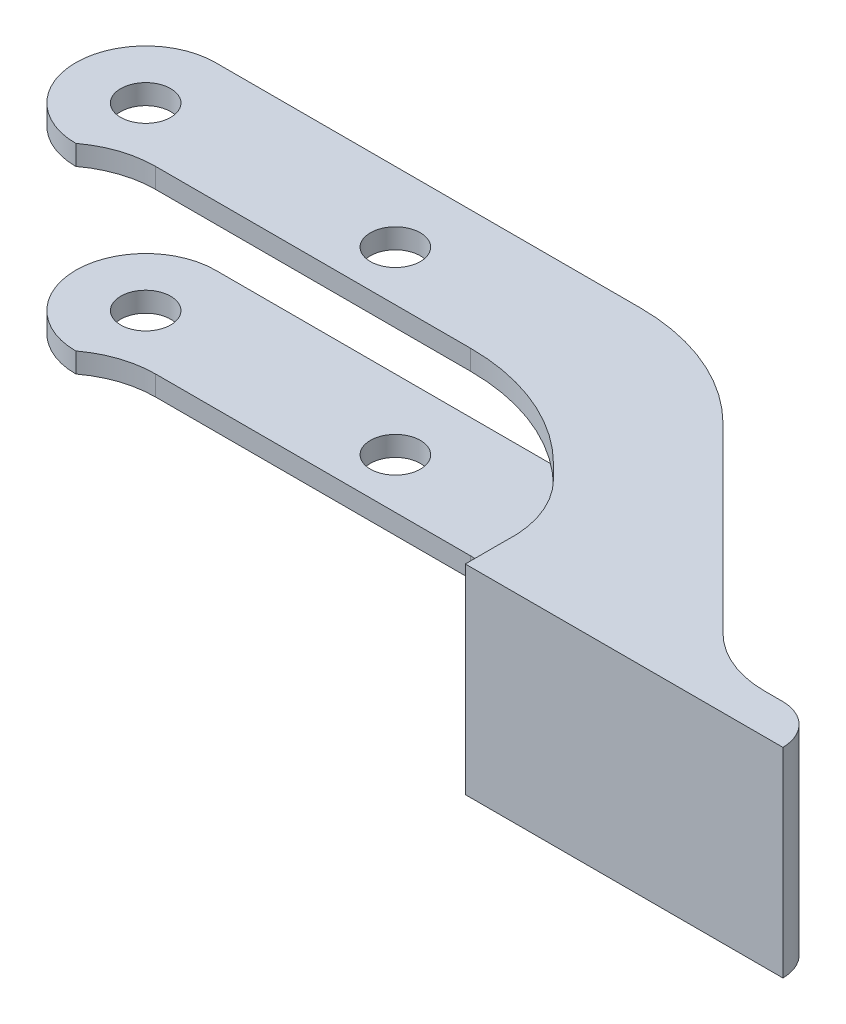
ISO-10303-21;
HEADER;
FILE_DESCRIPTION(('STEP AP214'),'2;1');
FILE_NAME('part.step','',(''),(''),'','','');
FILE_SCHEMA(('AUTOMOTIVE_DESIGN { 1 0 10303 214 1 1 1 1 }'));
ENDSEC;
DATA;
#1=APPLICATION_CONTEXT('core data for automotive mechanical design processes');
#2=APPLICATION_PROTOCOL_DEFINITION('international standard','automotive_design',2000,#1);
#3=PRODUCT_CONTEXT('',#1,'mechanical');
#4=PRODUCT('Part','Part','',(#3));
#5=PRODUCT_RELATED_PRODUCT_CATEGORY('part','',(#4));
#6=PRODUCT_DEFINITION_FORMATION('','',#4);
#7=PRODUCT_DEFINITION_CONTEXT('part definition',#1,'design');
#8=PRODUCT_DEFINITION('design','',#6,#7);
#9=PRODUCT_DEFINITION_SHAPE('','',#8);
#10=(LENGTH_UNIT() NAMED_UNIT(*) SI_UNIT(.MILLI.,.METRE.));
#11=(NAMED_UNIT(*) PLANE_ANGLE_UNIT() SI_UNIT($,.RADIAN.));
#12=(NAMED_UNIT(*) SI_UNIT($,.STERADIAN.) SOLID_ANGLE_UNIT());
#13=UNCERTAINTY_MEASURE_WITH_UNIT(LENGTH_MEASURE(1.E-05),#10,'distance_accuracy_value','');
#14=(GEOMETRIC_REPRESENTATION_CONTEXT(3) GLOBAL_UNCERTAINTY_ASSIGNED_CONTEXT((#13)) GLOBAL_UNIT_ASSIGNED_CONTEXT((#10,
#11,#12)) REPRESENTATION_CONTEXT('',''));
#15=CARTESIAN_POINT('',(0.,0.,0.));
#16=DIRECTION('',(0.,0.,1.));
#17=DIRECTION('',(1.,0.,0.));
#18=AXIS2_PLACEMENT_3D('',#15,#16,#17);
#19=CARTESIAN_POINT('',(55.9705627484771,0.,20.0040024503266));
#20=DIRECTION('',(0.,0.,-1.));
#21=DIRECTION('',(-1.,0.,0.));
#22=AXIS2_PLACEMENT_3D('',#19,#20,#21);
#23=PLANE('',#22);
#24=DIRECTION('',(0.,1.,0.));
#25=VECTOR('',#24,1.);
#26=CARTESIAN_POINT('',(55.9705627484771,0.,20.0040024503266));
#27=LINE('',#26,#25);
#28=CARTESIAN_POINT('',(55.9705627484771,2.,20.0040024503266));
#29=VERTEX_POINT('',#28);
#30=CARTESIAN_POINT('',(55.9705627484771,18.,20.0040024503266));
#31=VERTEX_POINT('',#30);
#32=EDGE_CURVE('E318',#29,#31,#27,.T.);
#33=ORIENTED_EDGE('',*,*,#32,.T.);
#34=DIRECTION('',(1.,0.,0.));
#35=VECTOR('',#34,1.);
#36=CARTESIAN_POINT('',(55.9705627484771,18.,20.0040024503266));
#37=LINE('',#36,#35);
#38=CARTESIAN_POINT('',(81.9451279472808,18.,20.0040024503266));
#39=VERTEX_POINT('',#38);
#40=EDGE_CURVE('E268',#31,#39,#37,.T.);
#41=ORIENTED_EDGE('',*,*,#40,.T.);
#42=DIRECTION('',(0.,1.,0.));
#43=VECTOR('',#42,1.);
#44=CARTESIAN_POINT('',(81.9451279472808,0.,20.0040024503266));
#45=LINE('',#44,#43);
#46=CARTESIAN_POINT('',(81.9451279472808,20.,20.0040024503266));
#47=VERTEX_POINT('',#46);
#48=EDGE_CURVE('E216',#39,#47,#45,.T.);
#49=ORIENTED_EDGE('',*,*,#48,.T.);
#50=DIRECTION('',(-1.,0.,0.));
#51=VECTOR('',#50,1.);
#52=CARTESIAN_POINT('',(55.9705627484771,20.,20.0040024503266));
#53=LINE('',#52,#51);
#54=CARTESIAN_POINT('',(83.76969240085,20.,20.0040024503266));
#55=VERTEX_POINT('',#54);
#56=EDGE_CURVE('E213',#55,#47,#53,.T.);
#57=ORIENTED_EDGE('',*,*,#56,.F.);
#58=DIRECTION('',(0.,1.,0.));
#59=VECTOR('',#58,1.);
#60=CARTESIAN_POINT('',(83.76969240085,0.,20.0040024503266));
#61=LINE('',#60,#59);
#62=CARTESIAN_POINT('',(83.76969240085,0.,20.0040024503266));
#63=VERTEX_POINT('',#62);
#64=EDGE_CURVE('E206',#55,#63,#61,.F.);
#65=ORIENTED_EDGE('',*,*,#64,.T.);
#66=DIRECTION('',(-1.,0.,0.));
#67=VECTOR('',#66,1.);
#68=CARTESIAN_POINT('',(55.9705627484771,0.,20.0040024503266));
#69=LINE('',#68,#67);
#70=CARTESIAN_POINT('',(81.9451279472808,0.,20.0040024503266));
#71=VERTEX_POINT('',#70);
#72=EDGE_CURVE('E210',#63,#71,#69,.T.);
#73=ORIENTED_EDGE('',*,*,#72,.T.);
#74=DIRECTION('',(0.,1.,0.));
#75=VECTOR('',#74,1.);
#76=CARTESIAN_POINT('',(81.9451279472808,2.,20.0040024503266));
#77=LINE('',#76,#75);
#78=CARTESIAN_POINT('',(81.9451279472808,2.,20.0040024503266));
#79=VERTEX_POINT('',#78);
#80=EDGE_CURVE('E228',#71,#79,#77,.T.);
#81=ORIENTED_EDGE('',*,*,#80,.T.);
#82=DIRECTION('',(-1.,0.,0.));
#83=VECTOR('',#82,1.);
#84=CARTESIAN_POINT('',(0.,2.,20.0040024503266));
#85=LINE('',#84,#83);
#86=EDGE_CURVE('E250',#79,#29,#85,.T.);
#87=ORIENTED_EDGE('',*,*,#86,.T.);
#88=EDGE_LOOP('',(#33,#41,#49,#57,#65,#73,#81,#87));
#89=FACE_BOUND('',#88,.T.);
#90=ADVANCED_FACE('F38',(#89),#23,.T.);
#91=CARTESIAN_POINT('',(0.,2.,0.));
#92=DIRECTION('',(0.,1.,0.));
#93=DIRECTION('',(0.,0.,1.));
#94=AXIS2_PLACEMENT_3D('',#91,#92,#93);
#95=PLANE('',#94);
#96=CARTESIAN_POINT('',(46.1591362625864,2.,0.));
#97=DIRECTION('',(0.,1.,0.));
#98=DIRECTION('',(0.,0.,1.));
#99=AXIS2_PLACEMENT_3D('',#96,#97,#98);
#100=CIRCLE('',#99,3.);
#101=CARTESIAN_POINT('',(46.1591362625864,2.,3.));
#102=VERTEX_POINT('',#101);
#103=EDGE_CURVE('E454',#102,#102,#100,.T.);
#104=ORIENTED_EDGE('',*,*,#103,.F.);
#105=EDGE_LOOP('',(#104));
#106=FACE_BOUND('',#105,.T.);
#107=CARTESIAN_POINT('',(0.,2.,0.));
#108=DIRECTION('',(0.,1.,0.));
#109=DIRECTION('',(0.,0.,1.));
#110=AXIS2_PLACEMENT_3D('',#107,#108,#109);
#111=CIRCLE('',#110,7.);
#112=CARTESIAN_POINT('',(0.,2.,-7.));
#113=VERTEX_POINT('',#112);
#114=CARTESIAN_POINT('',(0.,2.,7.));
#115=VERTEX_POINT('',#114);
#116=EDGE_CURVE('E287',#113,#115,#111,.T.);
#117=ORIENTED_EDGE('',*,*,#116,.T.);
#118=CARTESIAN_POINT('',(5.99999999999999,2.,15.));
#119=DIRECTION('',(0.,1.,0.));
#120=DIRECTION('',(0.,0.,1.));
#121=AXIS2_PLACEMENT_3D('',#118,#119,#120);
#122=CIRCLE('',#121,10.);
#123=CARTESIAN_POINT('',(5.99999999999999,2.,4.99999999999999));
#124=VERTEX_POINT('',#123);
#125=EDGE_CURVE('E46',#115,#124,#122,.F.);
#126=ORIENTED_EDGE('',*,*,#125,.T.);
#127=DIRECTION('',(-1.,0.,0.));
#128=VECTOR('',#127,1.);
#129=CARTESIAN_POINT('',(0.,2.,4.99999999999999));
#130=LINE('',#129,#128);
#131=CARTESIAN_POINT('',(37.5441558772842,2.,4.99999999999999));
#132=VERTEX_POINT('',#131);
#133=EDGE_CURVE('E379',#132,#124,#130,.T.);
#134=ORIENTED_EDGE('',*,*,#133,.F.);
#135=CARTESIAN_POINT('',(37.5441558772843,2.,25.));
#136=DIRECTION('',(0.,1.,0.));
#137=DIRECTION('',(0.,0.,1.));
#138=AXIS2_PLACEMENT_3D('',#135,#136,#137);
#139=CIRCLE('',#138,20.);
#140=CARTESIAN_POINT('',(51.6862915010153,2.,10.8578643762691));
#141=VERTEX_POINT('',#140);
#142=EDGE_CURVE('E375',#141,#132,#139,.T.);
#143=ORIENTED_EDGE('',*,*,#142,.F.);
#144=DIRECTION('',(-0.707106781186547,0.,-0.707106781186548));
#145=VECTOR('',#144,1.);
#146=CARTESIAN_POINT('',(20.4142135623731,2.,-20.4142135623731));
#147=LINE('',#146,#145);
#148=CARTESIAN_POINT('',(53.0658469263745,2.,12.2374198016283));
#149=VERTEX_POINT('',#148);
#150=EDGE_CURVE('E274',#149,#141,#147,.T.);
#151=ORIENTED_EDGE('',*,*,#150,.F.);
#152=CARTESIAN_POINT('',(45.994779114509,2.,19.3084876134938));
#153=DIRECTION('',(0.,1.,0.));
#154=DIRECTION('',(0.,0.,1.));
#155=AXIS2_PLACEMENT_3D('',#152,#153,#154);
#156=CIRCLE('',#155,10.);
#157=EDGE_CURVE('E408',#149,#29,#156,.F.);
#158=ORIENTED_EDGE('',*,*,#157,.T.);
#159=ORIENTED_EDGE('',*,*,#86,.F.);
#160=CARTESIAN_POINT('',(81.9451279472808,2.,10.0040024503266));
#161=DIRECTION('',(0.,1.,0.));
#162=DIRECTION('',(0.,0.,1.));
#163=AXIS2_PLACEMENT_3D('',#160,#161,#162);
#164=CIRCLE('',#163,10.);
#165=CARTESIAN_POINT('',(74.8740601354152,2.,17.075070262192));
#166=VERTEX_POINT('',#165);
#167=EDGE_CURVE('E247',#79,#166,#164,.F.);
#168=ORIENTED_EDGE('',*,*,#167,.T.);
#169=DIRECTION('',(0.707106781186545,0.,0.70710678118655));
#170=VECTOR('',#169,1.);
#171=CARTESIAN_POINT('',(71.8700576850888,2.,14.0710678118655));
#172=LINE('',#171,#170);
#173=CARTESIAN_POINT('',(56.6568542494924,2.,-1.14213562373091));
#174=VERTEX_POINT('',#173);
#175=EDGE_CURVE('E262',#174,#166,#172,.T.);
#176=ORIENTED_EDGE('',*,*,#175,.F.);
#177=CARTESIAN_POINT('',(42.5147186257615,2.,13.));
#178=DIRECTION('',(0.,-1.,0.));
#179=DIRECTION('',(0.,0.,-1.));
#180=AXIS2_PLACEMENT_3D('',#177,#178,#179);
#181=CIRCLE('',#180,20.);
#182=CARTESIAN_POINT('',(42.5147186257614,2.,-7.));
#183=VERTEX_POINT('',#182);
#184=EDGE_CURVE('E261',#183,#174,#181,.T.);
#185=ORIENTED_EDGE('',*,*,#184,.F.);
#186=DIRECTION('',(-1.,0.,0.));
#187=VECTOR('',#186,1.);
#188=CARTESIAN_POINT('',(0.,2.,-7.));
#189=LINE('',#188,#187);
#190=EDGE_CURVE('E249',#183,#113,#189,.T.);
#191=ORIENTED_EDGE('',*,*,#190,.T.);
#192=EDGE_LOOP('',(#117,#126,#134,#143,#151,#158,#159,#168,#176,#185,#191));
#193=FACE_BOUND('',#192,.T.);
#194=CARTESIAN_POINT('',(0.,2.,0.));
#195=DIRECTION('',(0.,1.,0.));
#196=DIRECTION('',(0.,0.,1.));
#197=AXIS2_PLACEMENT_3D('',#194,#195,#196);
#198=CIRCLE('',#197,2.5);
#199=CARTESIAN_POINT('',(0.,2.,2.5));
#200=VERTEX_POINT('',#199);
#201=EDGE_CURVE('E292',#200,#200,#198,.T.);
#202=ORIENTED_EDGE('',*,*,#201,.F.);
#203=EDGE_LOOP('',(#202));
#204=FACE_BOUND('',#203,.T.);
#205=CARTESIAN_POINT('',(25.,2.,0.));
#206=DIRECTION('',(0.,1.,0.));
#207=DIRECTION('',(0.,0.,1.));
#208=AXIS2_PLACEMENT_3D('',#205,#206,#207);
#209=CIRCLE('',#208,2.5);
#210=CARTESIAN_POINT('',(25.,2.,2.5));
#211=VERTEX_POINT('',#210);
#212=EDGE_CURVE('E295',#211,#211,#209,.T.);
#213=ORIENTED_EDGE('',*,*,#212,.F.);
#214=EDGE_LOOP('',(#213));
#215=FACE_BOUND('',#214,.T.);
#216=ADVANCED_FACE('F433',(#106,#193,#204,#215),#95,.T.);
#217=CARTESIAN_POINT('',(0.,0.,0.));
#218=DIRECTION('',(0.,1.,0.));
#219=DIRECTION('',(0.,0.,1.));
#220=AXIS2_PLACEMENT_3D('',#217,#218,#219);
#221=PLANE('',#220);
#222=DIRECTION('',(0.,0.,1.));
#223=VECTOR('',#222,1.);
#224=CARTESIAN_POINT('',(55.9705627484771,0.,20.0040024503266));
#225=LINE('',#224,#223);
#226=CARTESIAN_POINT('',(55.9705627484771,0.,20.0040024503266));
#227=VERTEX_POINT('',#226);
#228=CARTESIAN_POINT('',(55.9705627484771,0.,23.9705627484772));
#229=VERTEX_POINT('',#228);
#230=EDGE_CURVE('E315',#227,#229,#225,.T.);
#231=ORIENTED_EDGE('',*,*,#230,.F.);
#232=CARTESIAN_POINT('',(45.994779114509,0.,19.3084876134938));
#233=DIRECTION('',(0.,1.,0.));
#234=DIRECTION('',(0.,0.,1.));
#235=AXIS2_PLACEMENT_3D('',#232,#233,#234);
#236=CIRCLE('',#235,10.);
#237=CARTESIAN_POINT('',(53.0658469263745,0.,12.2374198016283));
#238=VERTEX_POINT('',#237);
#239=EDGE_CURVE('E406',#227,#238,#236,.T.);
#240=ORIENTED_EDGE('',*,*,#239,.T.);
#241=DIRECTION('',(0.707106781186547,0.,0.707106781186548));
#242=VECTOR('',#241,1.);
#243=CARTESIAN_POINT('',(60.8324295750727,0.,20.0040024503266));
#244=LINE('',#243,#242);
#245=CARTESIAN_POINT('',(51.6862915010153,0.,10.8578643762691));
#246=VERTEX_POINT('',#245);
#247=EDGE_CURVE('E378',#246,#238,#244,.T.);
#248=ORIENTED_EDGE('',*,*,#247,.F.);
#249=CARTESIAN_POINT('',(37.5441558772843,0.,25.));
#250=DIRECTION('',(0.,-1.,0.));
#251=DIRECTION('',(0.,0.,1.));
#252=AXIS2_PLACEMENT_3D('',#249,#250,#251);
#253=CIRCLE('',#252,20.);
#254=CARTESIAN_POINT('',(37.5441558772842,0.,4.99999999999999));
#255=VERTEX_POINT('',#254);
#256=EDGE_CURVE('E382',#255,#246,#253,.T.);
#257=ORIENTED_EDGE('',*,*,#256,.F.);
#258=DIRECTION('',(1.,0.,0.));
#259=VECTOR('',#258,1.);
#260=CARTESIAN_POINT('',(25.,0.,4.99999999999999));
#261=LINE('',#260,#259);
#262=CARTESIAN_POINT('',(5.99999999999999,0.,4.99999999999999));
#263=VERTEX_POINT('',#262);
#264=EDGE_CURVE('E381',#263,#255,#261,.T.);
#265=ORIENTED_EDGE('',*,*,#264,.F.);
#266=CARTESIAN_POINT('',(5.99999999999999,0.,15.));
#267=DIRECTION('',(0.,1.,0.));
#268=DIRECTION('',(0.,0.,1.));
#269=AXIS2_PLACEMENT_3D('',#266,#267,#268);
#270=CIRCLE('',#269,10.);
#271=CARTESIAN_POINT('',(0.,0.,7.));
#272=VERTEX_POINT('',#271);
#273=EDGE_CURVE('E53',#263,#272,#270,.T.);
#274=ORIENTED_EDGE('',*,*,#273,.T.);
#275=CARTESIAN_POINT('',(0.,0.,0.));
#276=DIRECTION('',(0.,1.,0.));
#277=DIRECTION('',(0.,0.,1.));
#278=AXIS2_PLACEMENT_3D('',#275,#276,#277);
#279=CIRCLE('',#278,7.);
#280=CARTESIAN_POINT('',(0.,0.,-7.));
#281=VERTEX_POINT('',#280);
#282=EDGE_CURVE('E280',#281,#272,#279,.T.);
#283=ORIENTED_EDGE('',*,*,#282,.F.);
#284=DIRECTION('',(-1.,0.,0.));
#285=VECTOR('',#284,1.);
#286=CARTESIAN_POINT('',(0.,0.,-7.));
#287=LINE('',#286,#285);
#288=CARTESIAN_POINT('',(42.5147186257614,0.,-7.));
#289=VERTEX_POINT('',#288);
#290=EDGE_CURVE('E279',#289,#281,#287,.T.);
#291=ORIENTED_EDGE('',*,*,#290,.F.);
#292=CARTESIAN_POINT('',(42.5147186257615,0.,13.));
#293=DIRECTION('',(0.,-1.,0.));
#294=DIRECTION('',(0.,0.,-1.));
#295=AXIS2_PLACEMENT_3D('',#292,#293,#294);
#296=CIRCLE('',#295,20.);
#297=CARTESIAN_POINT('',(56.6568542494924,0.,-1.14213562373091));
#298=VERTEX_POINT('',#297);
#299=EDGE_CURVE('E289',#289,#298,#296,.T.);
#300=ORIENTED_EDGE('',*,*,#299,.T.);
#301=DIRECTION('',(0.707106781186542,0.,0.707106781186553));
#302=VECTOR('',#301,1.);
#303=CARTESIAN_POINT('',(71.8700576850888,0.,14.0710678118655));
#304=LINE('',#303,#302);
#305=CARTESIAN_POINT('',(74.8740601354152,0.,17.075070262192));
#306=VERTEX_POINT('',#305);
#307=EDGE_CURVE('E238',#298,#306,#304,.T.);
#308=ORIENTED_EDGE('',*,*,#307,.T.);
#309=CARTESIAN_POINT('',(81.9451279472808,0.,10.0040024503266));
#310=DIRECTION('',(0.,1.,0.));
#311=DIRECTION('',(0.,0.,1.));
#312=AXIS2_PLACEMENT_3D('',#309,#310,#311);
#313=CIRCLE('',#312,10.);
#314=EDGE_CURVE('E226',#306,#71,#313,.T.);
#315=ORIENTED_EDGE('',*,*,#314,.T.);
#316=ORIENTED_EDGE('',*,*,#72,.F.);
#317=CARTESIAN_POINT('',(83.76969240085,0.,24.0040024503266));
#318=DIRECTION('',(0.,1.,0.));
#319=DIRECTION('',(0.,0.,1.));
#320=AXIS2_PLACEMENT_3D('',#317,#318,#319);
#321=CIRCLE('',#320,4.);
#322=CARTESIAN_POINT('',(87.7695526217003,0.,23.9705627484772));
#323=VERTEX_POINT('',#322);
#324=EDGE_CURVE('E222',#63,#323,#321,.F.);
#325=ORIENTED_EDGE('',*,*,#324,.T.);
#326=DIRECTION('',(-1.,0.,0.));
#327=VECTOR('',#326,1.);
#328=CARTESIAN_POINT('',(61.9705627484771,0.,23.9705627484772));
#329=LINE('',#328,#327);
#330=EDGE_CURVE('E234',#323,#229,#329,.T.);
#331=ORIENTED_EDGE('',*,*,#330,.T.);
#332=EDGE_LOOP('',(#231,#240,#248,#257,#265,#274,#283,#291,#300,#308,#315,#316,#325,#331));
#333=FACE_BOUND('',#332,.T.);
#334=CARTESIAN_POINT('',(0.,0.,0.));
#335=DIRECTION('',(0.,1.,0.));
#336=DIRECTION('',(0.,0.,1.));
#337=AXIS2_PLACEMENT_3D('',#334,#335,#336);
#338=CIRCLE('',#337,2.5);
#339=CARTESIAN_POINT('',(0.,0.,2.5));
#340=VERTEX_POINT('',#339);
#341=EDGE_CURVE('E236',#340,#340,#338,.T.);
#342=ORIENTED_EDGE('',*,*,#341,.T.);
#343=EDGE_LOOP('',(#342));
#344=FACE_BOUND('',#343,.T.);
#345=CARTESIAN_POINT('',(25.,0.,0.));
#346=DIRECTION('',(0.,1.,0.));
#347=DIRECTION('',(0.,0.,1.));
#348=AXIS2_PLACEMENT_3D('',#345,#346,#347);
#349=CIRCLE('',#348,2.5);
#350=CARTESIAN_POINT('',(25.,0.,2.5));
#351=VERTEX_POINT('',#350);
#352=EDGE_CURVE('E285',#351,#351,#349,.T.);
#353=ORIENTED_EDGE('',*,*,#352,.T.);
#354=EDGE_LOOP('',(#353));
#355=FACE_BOUND('',#354,.T.);
#356=ADVANCED_FACE('F220',(#333,#344,#355),#221,.F.);
#357=CARTESIAN_POINT('',(0.,2.,0.));
#358=DIRECTION('',(0.,-1.,0.));
#359=DIRECTION('',(0.,0.,-1.));
#360=AXIS2_PLACEMENT_3D('',#357,#358,#359);
#361=CYLINDRICAL_SURFACE('',#360,7.);
#362=ORIENTED_EDGE('',*,*,#282,.T.);
#363=DIRECTION('',(0.,-1.,0.));
#364=VECTOR('',#363,1.);
#365=CARTESIAN_POINT('',(0.,2.,7.));
#366=LINE('',#365,#364);
#367=EDGE_CURVE('E272',#115,#272,#366,.T.);
#368=ORIENTED_EDGE('',*,*,#367,.F.);
#369=ORIENTED_EDGE('',*,*,#116,.F.);
#370=DIRECTION('',(0.,-1.,0.));
#371=VECTOR('',#370,1.);
#372=CARTESIAN_POINT('',(0.,2.,-7.));
#373=LINE('',#372,#371);
#374=EDGE_CURVE('E276',#113,#281,#373,.T.);
#375=ORIENTED_EDGE('',*,*,#374,.T.);
#376=EDGE_LOOP('',(#362,#368,#369,#375));
#377=FACE_BOUND('',#376,.T.);
#378=ADVANCED_FACE('F425',(#377),#361,.T.);
#379=CARTESIAN_POINT('',(0.,2.,-7.));
#380=DIRECTION('',(0.,0.,1.));
#381=DIRECTION('',(1.,0.,0.));
#382=AXIS2_PLACEMENT_3D('',#379,#380,#381);
#383=PLANE('',#382);
#384=ORIENTED_EDGE('',*,*,#290,.T.);
#385=ORIENTED_EDGE('',*,*,#374,.F.);
#386=ORIENTED_EDGE('',*,*,#190,.F.);
#387=DIRECTION('',(0.,-1.,0.));
#388=VECTOR('',#387,1.);
#389=CARTESIAN_POINT('',(42.5147186257614,2.,-7.));
#390=LINE('',#389,#388);
#391=EDGE_CURVE('E282',#183,#289,#390,.T.);
#392=ORIENTED_EDGE('',*,*,#391,.T.);
#393=EDGE_LOOP('',(#384,#385,#386,#392));
#394=FACE_BOUND('',#393,.T.);
#395=ADVANCED_FACE('F594',(#394),#383,.F.);
#396=CARTESIAN_POINT('',(0.,2.,0.));
#397=DIRECTION('',(0.,-1.,0.));
#398=DIRECTION('',(0.,0.,-1.));
#399=AXIS2_PLACEMENT_3D('',#396,#397,#398);
#400=CYLINDRICAL_SURFACE('',#399,2.5);
#401=ORIENTED_EDGE('',*,*,#201,.T.);
#402=EDGE_LOOP('',(#401));
#403=FACE_BOUND('',#402,.T.);
#404=ORIENTED_EDGE('',*,*,#341,.F.);
#405=EDGE_LOOP('',(#404));
#406=FACE_BOUND('',#405,.T.);
#407=ADVANCED_FACE('F527',(#403,#406),#400,.F.);
#408=CARTESIAN_POINT('',(25.,2.,0.));
#409=DIRECTION('',(0.,-1.,0.));
#410=DIRECTION('',(0.,0.,-1.));
#411=AXIS2_PLACEMENT_3D('',#408,#409,#410);
#412=CYLINDRICAL_SURFACE('',#411,2.5);
#413=ORIENTED_EDGE('',*,*,#212,.T.);
#414=EDGE_LOOP('',(#413));
#415=FACE_BOUND('',#414,.T.);
#416=ORIENTED_EDGE('',*,*,#352,.F.);
#417=EDGE_LOOP('',(#416));
#418=FACE_BOUND('',#417,.T.);
#419=ADVANCED_FACE('F518',(#415,#418),#412,.F.);
#420=CARTESIAN_POINT('',(61.9705627484771,2.,23.9705627484772));
#421=DIRECTION('',(0.,0.,1.));
#422=DIRECTION('',(1.,0.,0.));
#423=AXIS2_PLACEMENT_3D('',#420,#421,#422);
#424=PLANE('',#423);
#425=DIRECTION('',(0.,1.,0.));
#426=VECTOR('',#425,1.);
#427=CARTESIAN_POINT('',(87.7695526217003,0.,23.9705627484772));
#428=LINE('',#427,#426);
#429=CARTESIAN_POINT('',(87.7695526217003,20.,23.9705627484772));
#430=VERTEX_POINT('',#429);
#431=EDGE_CURVE('E233',#323,#430,#428,.T.);
#432=ORIENTED_EDGE('',*,*,#431,.T.);
#433=DIRECTION('',(1.,0.,0.));
#434=VECTOR('',#433,1.);
#435=CARTESIAN_POINT('',(55.9705627484771,20.,23.9705627484772));
#436=LINE('',#435,#434);
#437=CARTESIAN_POINT('',(55.9705627484771,20.,23.9705627484772));
#438=VERTEX_POINT('',#437);
#439=EDGE_CURVE('E245',#438,#430,#436,.T.);
#440=ORIENTED_EDGE('',*,*,#439,.F.);
#441=DIRECTION('',(0.,1.,0.));
#442=VECTOR('',#441,1.);
#443=CARTESIAN_POINT('',(55.9705627484771,0.,23.9705627484772));
#444=LINE('',#443,#442);
#445=EDGE_CURVE('E304',#229,#438,#444,.T.);
#446=ORIENTED_EDGE('',*,*,#445,.F.);
#447=ORIENTED_EDGE('',*,*,#330,.F.);
#448=EDGE_LOOP('',(#432,#440,#446,#447));
#449=FACE_BOUND('',#448,.T.);
#450=ADVANCED_FACE('F515',(#449),#424,.T.);
#451=CARTESIAN_POINT('',(71.8700576850888,2.,14.0710678118655));
#452=DIRECTION('',(0.707106781186553,0.,-0.707106781186542));
#453=DIRECTION('',(-0.707106781186542,0.,-0.707106781186553));
#454=AXIS2_PLACEMENT_3D('',#451,#452,#453);
#455=PLANE('',#454);
#456=ORIENTED_EDGE('',*,*,#175,.T.);
#457=DIRECTION('',(0.,1.,0.));
#458=VECTOR('',#457,1.);
#459=CARTESIAN_POINT('',(74.8740601354152,0.,17.075070262192));
#460=LINE('',#459,#458);
#461=EDGE_CURVE('E259',#166,#306,#460,.F.);
#462=ORIENTED_EDGE('',*,*,#461,.T.);
#463=ORIENTED_EDGE('',*,*,#307,.F.);
#464=DIRECTION('',(0.,-1.,0.));
#465=VECTOR('',#464,1.);
#466=CARTESIAN_POINT('',(56.6568542494924,2.,-1.14213562373091));
#467=LINE('',#466,#465);
#468=EDGE_CURVE('E302',#174,#298,#467,.T.);
#469=ORIENTED_EDGE('',*,*,#468,.F.);
#470=EDGE_LOOP('',(#456,#462,#463,#469));
#471=FACE_BOUND('',#470,.T.);
#472=ADVANCED_FACE('F517',(#471),#455,.T.);
#473=CARTESIAN_POINT('',(42.5147186257615,2.,13.));
#474=DIRECTION('',(0.,-1.,0.));
#475=DIRECTION('',(0.,0.,-1.));
#476=AXIS2_PLACEMENT_3D('',#473,#474,#475);
#477=CYLINDRICAL_SURFACE('',#476,20.);
#478=ORIENTED_EDGE('',*,*,#299,.F.);
#479=ORIENTED_EDGE('',*,*,#391,.F.);
#480=ORIENTED_EDGE('',*,*,#184,.T.);
#481=ORIENTED_EDGE('',*,*,#468,.T.);
#482=EDGE_LOOP('',(#478,#479,#480,#481));
#483=FACE_BOUND('',#482,.T.);
#484=ADVANCED_FACE('F524',(#483),#477,.T.);
#485=CARTESIAN_POINT('',(55.9705627484771,0.,20.0040024503266));
#486=DIRECTION('',(-1.,0.,0.));
#487=DIRECTION('',(0.,0.,1.));
#488=AXIS2_PLACEMENT_3D('',#485,#486,#487);
#489=PLANE('',#488);
#490=ORIENTED_EDGE('',*,*,#445,.T.);
#491=DIRECTION('',(0.,0.,1.));
#492=VECTOR('',#491,1.);
#493=CARTESIAN_POINT('',(55.9705627484771,20.,20.0040024503266));
#494=LINE('',#493,#492);
#495=CARTESIAN_POINT('',(55.9705627484771,20.,20.0040024503266));
#496=VERTEX_POINT('',#495);
#497=EDGE_CURVE('E323',#496,#438,#494,.T.);
#498=ORIENTED_EDGE('',*,*,#497,.F.);
#499=EDGE_CURVE('E319',#31,#496,#27,.T.);
#500=ORIENTED_EDGE('',*,*,#499,.F.);
#501=ORIENTED_EDGE('',*,*,#32,.F.);
#502=EDGE_CURVE('E271',#227,#29,#27,.T.);
#503=ORIENTED_EDGE('',*,*,#502,.F.);
#504=ORIENTED_EDGE('',*,*,#230,.T.);
#505=EDGE_LOOP('',(#490,#498,#500,#501,#503,#504));
#506=FACE_BOUND('',#505,.T.);
#507=ADVANCED_FACE('F451',(#506),#489,.T.);
#508=CARTESIAN_POINT('',(0.,20.,0.));
#509=DIRECTION('',(0.,1.,0.));
#510=DIRECTION('',(0.,0.,1.));
#511=AXIS2_PLACEMENT_3D('',#508,#509,#510);
#512=PLANE('',#511);
#513=DIRECTION('',(0.707106781186547,0.,0.707106781186548));
#514=VECTOR('',#513,1.);
#515=CARTESIAN_POINT('',(60.8324295750727,20.,20.0040024503266));
#516=LINE('',#515,#514);
#517=CARTESIAN_POINT('',(51.6862915010153,20.,10.8578643762691));
#518=VERTEX_POINT('',#517);
#519=CARTESIAN_POINT('',(53.0658469263745,20.,12.2374198016283));
#520=VERTEX_POINT('',#519);
#521=EDGE_CURVE('E338',#518,#520,#516,.T.);
#522=ORIENTED_EDGE('',*,*,#521,.T.);
#523=CARTESIAN_POINT('',(45.994779114509,20.,19.3084876134938));
#524=DIRECTION('',(0.,1.,0.));
#525=DIRECTION('',(0.,0.,1.));
#526=AXIS2_PLACEMENT_3D('',#523,#524,#525);
#527=CIRCLE('',#526,10.);
#528=EDGE_CURVE('E404',#520,#496,#527,.F.);
#529=ORIENTED_EDGE('',*,*,#528,.T.);
#530=ORIENTED_EDGE('',*,*,#497,.T.);
#531=ORIENTED_EDGE('',*,*,#439,.T.);
#532=CARTESIAN_POINT('',(83.76969240085,20.,24.0040024503266));
#533=DIRECTION('',(0.,1.,0.));
#534=DIRECTION('',(0.,0.,1.));
#535=AXIS2_PLACEMENT_3D('',#532,#533,#534);
#536=CIRCLE('',#535,4.);
#537=EDGE_CURVE('E244',#430,#55,#536,.T.);
#538=ORIENTED_EDGE('',*,*,#537,.T.);
#539=ORIENTED_EDGE('',*,*,#56,.T.);
#540=CARTESIAN_POINT('',(81.9451279472808,20.,10.0040024503266));
#541=DIRECTION('',(0.,1.,0.));
#542=DIRECTION('',(0.,0.,1.));
#543=AXIS2_PLACEMENT_3D('',#540,#541,#542);
#544=CIRCLE('',#543,10.);
#545=CARTESIAN_POINT('',(74.8740601354153,20.,17.075070262192));
#546=VERTEX_POINT('',#545);
#547=EDGE_CURVE('E256',#47,#546,#544,.F.);
#548=ORIENTED_EDGE('',*,*,#547,.T.);
#549=DIRECTION('',(0.707106781186545,0.,0.70710678118655));
#550=VECTOR('',#549,1.);
#551=CARTESIAN_POINT('',(71.8700576850888,20.,14.0710678118655));
#552=LINE('',#551,#550);
#553=CARTESIAN_POINT('',(56.6568542494924,20.,-1.14213562373091));
#554=VERTEX_POINT('',#553);
#555=EDGE_CURVE('E266',#554,#546,#552,.T.);
#556=ORIENTED_EDGE('',*,*,#555,.F.);
#557=CARTESIAN_POINT('',(42.5147186257615,20.,13.));
#558=DIRECTION('',(0.,-1.,0.));
#559=DIRECTION('',(0.,0.,-1.));
#560=AXIS2_PLACEMENT_3D('',#557,#558,#559);
#561=CIRCLE('',#560,20.);
#562=CARTESIAN_POINT('',(42.5147186257614,20.,-7.));
#563=VERTEX_POINT('',#562);
#564=EDGE_CURVE('E334',#563,#554,#561,.T.);
#565=ORIENTED_EDGE('',*,*,#564,.F.);
#566=DIRECTION('',(1.,0.,0.));
#567=VECTOR('',#566,1.);
#568=CARTESIAN_POINT('',(42.5147186257615,20.,-7.));
#569=LINE('',#568,#567);
#570=CARTESIAN_POINT('',(0.,20.,-7.));
#571=VERTEX_POINT('',#570);
#572=EDGE_CURVE('E335',#571,#563,#569,.T.);
#573=ORIENTED_EDGE('',*,*,#572,.F.);
#574=CARTESIAN_POINT('',(0.,20.,0.));
#575=DIRECTION('',(0.,1.,0.));
#576=DIRECTION('',(0.,0.,1.));
#577=AXIS2_PLACEMENT_3D('',#574,#575,#576);
#578=CIRCLE('',#577,7.);
#579=CARTESIAN_POINT('',(0.,20.,7.));
#580=VERTEX_POINT('',#579);
#581=EDGE_CURVE('E258',#571,#580,#578,.T.);
#582=ORIENTED_EDGE('',*,*,#581,.T.);
#583=CARTESIAN_POINT('',(5.99999999999999,20.,15.));
#584=DIRECTION('',(0.,1.,0.));
#585=DIRECTION('',(0.,0.,1.));
#586=AXIS2_PLACEMENT_3D('',#583,#584,#585);
#587=CIRCLE('',#586,10.);
#588=CARTESIAN_POINT('',(5.99999999999999,20.,4.99999999999999));
#589=VERTEX_POINT('',#588);
#590=EDGE_CURVE('E418',#580,#589,#587,.F.);
#591=ORIENTED_EDGE('',*,*,#590,.T.);
#592=DIRECTION('',(1.,0.,0.));
#593=VECTOR('',#592,1.);
#594=CARTESIAN_POINT('',(0.,20.,5.));
#595=LINE('',#594,#593);
#596=CARTESIAN_POINT('',(37.5441558772842,20.,4.99999999999999));
#597=VERTEX_POINT('',#596);
#598=EDGE_CURVE('E357',#589,#597,#595,.T.);
#599=ORIENTED_EDGE('',*,*,#598,.T.);
#600=CARTESIAN_POINT('',(37.5441558772843,20.,25.));
#601=DIRECTION('',(0.,-1.,0.));
#602=DIRECTION('',(0.,0.,1.));
#603=AXIS2_PLACEMENT_3D('',#600,#601,#602);
#604=CIRCLE('',#603,20.);
#605=EDGE_CURVE('E395',#597,#518,#604,.T.);
#606=ORIENTED_EDGE('',*,*,#605,.T.);
#607=EDGE_LOOP('',(#522,#529,#530,#531,#538,#539,#548,#556,#565,#573,#582,#591,#599,#606));
#608=FACE_BOUND('',#607,.T.);
#609=CARTESIAN_POINT('',(25.,20.,0.));
#610=DIRECTION('',(0.,1.,0.));
#611=DIRECTION('',(0.,0.,1.));
#612=AXIS2_PLACEMENT_3D('',#609,#610,#611);
#613=CIRCLE('',#612,2.5);
#614=CARTESIAN_POINT('',(25.,20.,2.5));
#615=VERTEX_POINT('',#614);
#616=EDGE_CURVE('E363',#615,#615,#613,.T.);
#617=ORIENTED_EDGE('',*,*,#616,.F.);
#618=EDGE_LOOP('',(#617));
#619=FACE_BOUND('',#618,.T.);
#620=CARTESIAN_POINT('',(0.,20.,0.));
#621=DIRECTION('',(0.,1.,0.));
#622=DIRECTION('',(0.,0.,1.));
#623=AXIS2_PLACEMENT_3D('',#620,#621,#622);
#624=CIRCLE('',#623,2.5);
#625=CARTESIAN_POINT('',(0.,20.,2.5));
#626=VERTEX_POINT('',#625);
#627=EDGE_CURVE('E353',#626,#626,#624,.T.);
#628=ORIENTED_EDGE('',*,*,#627,.F.);
#629=EDGE_LOOP('',(#628));
#630=FACE_BOUND('',#629,.T.);
#631=ADVANCED_FACE('F479',(#608,#619,#630),#512,.T.);
#632=CARTESIAN_POINT('',(42.5147186257615,18.,-7.));
#633=DIRECTION('',(0.,0.,1.));
#634=DIRECTION('',(1.,0.,0.));
#635=AXIS2_PLACEMENT_3D('',#632,#633,#634);
#636=PLANE('',#635);
#637=ORIENTED_EDGE('',*,*,#572,.T.);
#638=DIRECTION('',(0.,1.,0.));
#639=VECTOR('',#638,1.);
#640=CARTESIAN_POINT('',(42.5147186257614,18.,-7.));
#641=LINE('',#640,#639);
#642=CARTESIAN_POINT('',(42.5147186257614,18.,-7.));
#643=VERTEX_POINT('',#642);
#644=EDGE_CURVE('E331',#643,#563,#641,.T.);
#645=ORIENTED_EDGE('',*,*,#644,.F.);
#646=DIRECTION('',(1.,0.,0.));
#647=VECTOR('',#646,1.);
#648=CARTESIAN_POINT('',(42.5147186257615,18.,-7.));
#649=LINE('',#648,#647);
#650=CARTESIAN_POINT('',(0.,18.,-7.));
#651=VERTEX_POINT('',#650);
#652=EDGE_CURVE('E342',#651,#643,#649,.T.);
#653=ORIENTED_EDGE('',*,*,#652,.F.);
#654=DIRECTION('',(0.,1.,0.));
#655=VECTOR('',#654,1.);
#656=CARTESIAN_POINT('',(0.,18.,-7.));
#657=LINE('',#656,#655);
#658=EDGE_CURVE('E337',#651,#571,#657,.T.);
#659=ORIENTED_EDGE('',*,*,#658,.T.);
#660=EDGE_LOOP('',(#637,#645,#653,#659));
#661=FACE_BOUND('',#660,.T.);
#662=ADVANCED_FACE('F495',(#661),#636,.F.);
#663=CARTESIAN_POINT('',(42.5147186257615,18.,13.));
#664=DIRECTION('',(0.,1.,0.));
#665=DIRECTION('',(0.,0.,1.));
#666=AXIS2_PLACEMENT_3D('',#663,#664,#665);
#667=CYLINDRICAL_SURFACE('',#666,20.);
#668=ORIENTED_EDGE('',*,*,#564,.T.);
#669=DIRECTION('',(0.,1.,0.));
#670=VECTOR('',#669,1.);
#671=CARTESIAN_POINT('',(56.6568542494924,18.,-1.14213562373091));
#672=LINE('',#671,#670);
#673=CARTESIAN_POINT('',(56.6568542494924,18.,-1.14213562373091));
#674=VERTEX_POINT('',#673);
#675=EDGE_CURVE('E265',#674,#554,#672,.T.);
#676=ORIENTED_EDGE('',*,*,#675,.F.);
#677=CARTESIAN_POINT('',(42.5147186257615,18.,13.));
#678=DIRECTION('',(0.,-1.,0.));
#679=DIRECTION('',(0.,0.,-1.));
#680=AXIS2_PLACEMENT_3D('',#677,#678,#679);
#681=CIRCLE('',#680,20.);
#682=EDGE_CURVE('E344',#643,#674,#681,.T.);
#683=ORIENTED_EDGE('',*,*,#682,.F.);
#684=ORIENTED_EDGE('',*,*,#644,.T.);
#685=EDGE_LOOP('',(#668,#676,#683,#684));
#686=FACE_BOUND('',#685,.T.);
#687=ADVANCED_FACE('F501',(#686),#667,.T.);
#688=CARTESIAN_POINT('',(71.8700576850888,18.,14.0710678118655));
#689=DIRECTION('',(-0.70710678118655,0.,0.707106781186545));
#690=DIRECTION('',(0.707106781186545,0.,0.70710678118655));
#691=AXIS2_PLACEMENT_3D('',#688,#689,#690);
#692=PLANE('',#691);
#693=ORIENTED_EDGE('',*,*,#555,.T.);
#694=DIRECTION('',(0.,1.,0.));
#695=VECTOR('',#694,1.);
#696=CARTESIAN_POINT('',(74.8740601354153,18.,17.075070262192));
#697=LINE('',#696,#695);
#698=CARTESIAN_POINT('',(74.8740601354153,18.,17.075070262192));
#699=VERTEX_POINT('',#698);
#700=EDGE_CURVE('E263',#546,#699,#697,.F.);
#701=ORIENTED_EDGE('',*,*,#700,.T.);
#702=DIRECTION('',(0.707106781186542,0.,0.707106781186553));
#703=VECTOR('',#702,1.);
#704=CARTESIAN_POINT('',(71.8700576850888,18.,14.0710678118655));
#705=LINE('',#704,#703);
#706=EDGE_CURVE('E255',#674,#699,#705,.T.);
#707=ORIENTED_EDGE('',*,*,#706,.F.);
#708=ORIENTED_EDGE('',*,*,#675,.T.);
#709=EDGE_LOOP('',(#693,#701,#707,#708));
#710=FACE_BOUND('',#709,.T.);
#711=ADVANCED_FACE('F505',(#710),#692,.F.);
#712=CARTESIAN_POINT('',(25.,18.,0.));
#713=DIRECTION('',(0.,1.,0.));
#714=DIRECTION('',(0.,0.,-1.));
#715=AXIS2_PLACEMENT_3D('',#712,#713,#714);
#716=PLANE('',#715);
#717=CARTESIAN_POINT('',(46.1591362625864,18.,0.));
#718=DIRECTION('',(0.,1.,0.));
#719=DIRECTION('',(0.,0.,1.));
#720=AXIS2_PLACEMENT_3D('',#717,#718,#719);
#721=CIRCLE('',#720,3.);
#722=CARTESIAN_POINT('',(46.1591362625864,18.,3.));
#723=VERTEX_POINT('',#722);
#724=EDGE_CURVE('E11',#723,#723,#721,.F.);
#725=ORIENTED_EDGE('',*,*,#724,.F.);
#726=EDGE_LOOP('',(#725));
#727=FACE_BOUND('',#726,.T.);
#728=DIRECTION('',(-1.,0.,0.));
#729=VECTOR('',#728,1.);
#730=CARTESIAN_POINT('',(25.,18.,4.99999999999999));
#731=LINE('',#730,#729);
#732=CARTESIAN_POINT('',(37.5441558772842,18.,4.99999999999999));
#733=VERTEX_POINT('',#732);
#734=CARTESIAN_POINT('',(5.99999999999999,18.,4.99999999999999));
#735=VERTEX_POINT('',#734);
#736=EDGE_CURVE('E241',#733,#735,#731,.T.);
#737=ORIENTED_EDGE('',*,*,#736,.T.);
#738=CARTESIAN_POINT('',(5.99999999999999,18.,15.));
#739=DIRECTION('',(0.,1.,0.));
#740=DIRECTION('',(0.,0.,1.));
#741=AXIS2_PLACEMENT_3D('',#738,#739,#740);
#742=CIRCLE('',#741,10.);
#743=CARTESIAN_POINT('',(0.,18.,7.));
#744=VERTEX_POINT('',#743);
#745=EDGE_CURVE('E416',#735,#744,#742,.T.);
#746=ORIENTED_EDGE('',*,*,#745,.T.);
#747=CARTESIAN_POINT('',(0.,18.,0.));
#748=DIRECTION('',(0.,1.,0.));
#749=DIRECTION('',(0.,0.,1.));
#750=AXIS2_PLACEMENT_3D('',#747,#748,#749);
#751=CIRCLE('',#750,7.);
#752=EDGE_CURVE('E354',#651,#744,#751,.T.);
#753=ORIENTED_EDGE('',*,*,#752,.F.);
#754=ORIENTED_EDGE('',*,*,#652,.T.);
#755=ORIENTED_EDGE('',*,*,#682,.T.);
#756=ORIENTED_EDGE('',*,*,#706,.T.);
#757=CARTESIAN_POINT('',(81.9451279472808,18.,10.0040024503266));
#758=DIRECTION('',(0.,1.,0.));
#759=DIRECTION('',(0.,0.,1.));
#760=AXIS2_PLACEMENT_3D('',#757,#758,#759);
#761=CIRCLE('',#760,10.);
#762=EDGE_CURVE('E251',#699,#39,#761,.T.);
#763=ORIENTED_EDGE('',*,*,#762,.T.);
#764=ORIENTED_EDGE('',*,*,#40,.F.);
#765=CARTESIAN_POINT('',(45.994779114509,18.,19.3084876134938));
#766=DIRECTION('',(0.,1.,0.));
#767=DIRECTION('',(0.,0.,1.));
#768=AXIS2_PLACEMENT_3D('',#765,#766,#767);
#769=CIRCLE('',#768,10.);
#770=CARTESIAN_POINT('',(53.0658469263745,18.,12.2374198016283));
#771=VERTEX_POINT('',#770);
#772=EDGE_CURVE('E402',#31,#771,#769,.T.);
#773=ORIENTED_EDGE('',*,*,#772,.T.);
#774=DIRECTION('',(-0.707106781186547,0.,-0.707106781186548));
#775=VECTOR('',#774,1.);
#776=CARTESIAN_POINT('',(32.9142135623731,18.,-7.91421356237308));
#777=LINE('',#776,#775);
#778=CARTESIAN_POINT('',(51.6862915010153,18.,10.8578643762691));
#779=VERTEX_POINT('',#778);
#780=EDGE_CURVE('E254',#771,#779,#777,.T.);
#781=ORIENTED_EDGE('',*,*,#780,.T.);
#782=CARTESIAN_POINT('',(37.5441558772843,18.,25.));
#783=DIRECTION('',(0.,1.,0.));
#784=DIRECTION('',(0.,0.,1.));
#785=AXIS2_PLACEMENT_3D('',#782,#783,#784);
#786=CIRCLE('',#785,20.);
#787=EDGE_CURVE('E372',#779,#733,#786,.T.);
#788=ORIENTED_EDGE('',*,*,#787,.T.);
#789=EDGE_LOOP('',(#737,#746,#753,#754,#755,#756,#763,#764,#773,#781,#788));
#790=FACE_BOUND('',#789,.T.);
#791=CARTESIAN_POINT('',(25.,18.,0.));
#792=DIRECTION('',(0.,1.,0.));
#793=DIRECTION('',(0.,0.,1.));
#794=AXIS2_PLACEMENT_3D('',#791,#792,#793);
#795=CIRCLE('',#794,2.5);
#796=CARTESIAN_POINT('',(25.,18.,2.5));
#797=VERTEX_POINT('',#796);
#798=EDGE_CURVE('E366',#797,#797,#795,.T.);
#799=ORIENTED_EDGE('',*,*,#798,.T.);
#800=EDGE_LOOP('',(#799));
#801=FACE_BOUND('',#800,.T.);
#802=CARTESIAN_POINT('',(0.,18.,0.));
#803=DIRECTION('',(0.,1.,0.));
#804=DIRECTION('',(0.,0.,1.));
#805=AXIS2_PLACEMENT_3D('',#802,#803,#804);
#806=CIRCLE('',#805,2.5);
#807=CARTESIAN_POINT('',(0.,18.,2.5));
#808=VERTEX_POINT('',#807);
#809=EDGE_CURVE('E360',#808,#808,#806,.T.);
#810=ORIENTED_EDGE('',*,*,#809,.T.);
#811=EDGE_LOOP('',(#810));
#812=FACE_BOUND('',#811,.T.);
#813=ADVANCED_FACE('F467',(#727,#790,#801,#812),#716,.F.);
#814=CARTESIAN_POINT('',(0.,18.,0.));
#815=DIRECTION('',(0.,1.,0.));
#816=DIRECTION('',(0.,0.,1.));
#817=AXIS2_PLACEMENT_3D('',#814,#815,#816);
#818=CYLINDRICAL_SURFACE('',#817,7.);
#819=ORIENTED_EDGE('',*,*,#581,.F.);
#820=ORIENTED_EDGE('',*,*,#658,.F.);
#821=ORIENTED_EDGE('',*,*,#752,.T.);
#822=DIRECTION('',(0.,1.,0.));
#823=VECTOR('',#822,1.);
#824=CARTESIAN_POINT('',(0.,18.,7.));
#825=LINE('',#824,#823);
#826=EDGE_CURVE('E351',#744,#580,#825,.T.);
#827=ORIENTED_EDGE('',*,*,#826,.T.);
#828=EDGE_LOOP('',(#819,#820,#821,#827));
#829=FACE_BOUND('',#828,.T.);
#830=ADVANCED_FACE('F493',(#829),#818,.T.);
#831=CARTESIAN_POINT('',(0.,18.,0.));
#832=DIRECTION('',(0.,1.,0.));
#833=DIRECTION('',(0.,0.,1.));
#834=AXIS2_PLACEMENT_3D('',#831,#832,#833);
#835=CYLINDRICAL_SURFACE('',#834,2.5);
#836=ORIENTED_EDGE('',*,*,#809,.F.);
#837=EDGE_LOOP('',(#836));
#838=FACE_BOUND('',#837,.T.);
#839=ORIENTED_EDGE('',*,*,#627,.T.);
#840=EDGE_LOOP('',(#839));
#841=FACE_BOUND('',#840,.T.);
#842=ADVANCED_FACE('F547',(#838,#841),#835,.F.);
#843=CARTESIAN_POINT('',(25.,18.,0.));
#844=DIRECTION('',(0.,1.,0.));
#845=DIRECTION('',(0.,0.,1.));
#846=AXIS2_PLACEMENT_3D('',#843,#844,#845);
#847=CYLINDRICAL_SURFACE('',#846,2.5);
#848=ORIENTED_EDGE('',*,*,#798,.F.);
#849=EDGE_LOOP('',(#848));
#850=FACE_BOUND('',#849,.T.);
#851=ORIENTED_EDGE('',*,*,#616,.T.);
#852=EDGE_LOOP('',(#851));
#853=FACE_BOUND('',#852,.T.);
#854=ADVANCED_FACE('F550',(#850,#853),#847,.F.);
#855=CARTESIAN_POINT('',(81.9451279472808,0.,10.0040024503266));
#856=DIRECTION('',(0.,1.,0.));
#857=DIRECTION('',(0.,0.,1.));
#858=AXIS2_PLACEMENT_3D('',#855,#856,#857);
#859=CYLINDRICAL_SURFACE('',#858,10.);
#860=ORIENTED_EDGE('',*,*,#762,.F.);
#861=ORIENTED_EDGE('',*,*,#700,.F.);
#862=ORIENTED_EDGE('',*,*,#547,.F.);
#863=ORIENTED_EDGE('',*,*,#48,.F.);
#864=EDGE_LOOP('',(#860,#861,#862,#863));
#865=FACE_BOUND('',#864,.T.);
#866=ADVANCED_FACE('F510',(#865),#859,.F.);
#867=CARTESIAN_POINT('',(81.9451279472808,0.,10.0040024503266));
#868=DIRECTION('',(0.,-1.,0.));
#869=DIRECTION('',(0.,0.,-1.));
#870=AXIS2_PLACEMENT_3D('',#867,#868,#869);
#871=CYLINDRICAL_SURFACE('',#870,10.);
#872=ORIENTED_EDGE('',*,*,#314,.F.);
#873=ORIENTED_EDGE('',*,*,#461,.F.);
#874=ORIENTED_EDGE('',*,*,#167,.F.);
#875=ORIENTED_EDGE('',*,*,#80,.F.);
#876=EDGE_LOOP('',(#872,#873,#874,#875));
#877=FACE_BOUND('',#876,.T.);
#878=ADVANCED_FACE('F586',(#877),#871,.F.);
#879=CARTESIAN_POINT('',(83.76969240085,0.,24.0040024503266));
#880=DIRECTION('',(0.,-1.,0.));
#881=DIRECTION('',(0.,0.,-1.));
#882=AXIS2_PLACEMENT_3D('',#879,#880,#881);
#883=CYLINDRICAL_SURFACE('',#882,4.);
#884=ORIENTED_EDGE('',*,*,#324,.F.);
#885=ORIENTED_EDGE('',*,*,#64,.F.);
#886=ORIENTED_EDGE('',*,*,#537,.F.);
#887=ORIENTED_EDGE('',*,*,#431,.F.);
#888=EDGE_LOOP('',(#884,#885,#886,#887));
#889=FACE_BOUND('',#888,.T.);
#890=ADVANCED_FACE('F231',(#889),#883,.T.);
#891=CARTESIAN_POINT('',(25.,20.,4.99999999999999));
#892=DIRECTION('',(0.,0.,-1.));
#893=DIRECTION('',(-1.,0.,0.));
#894=AXIS2_PLACEMENT_3D('',#891,#892,#893);
#895=PLANE('',#894);
#896=ORIENTED_EDGE('',*,*,#598,.F.);
#897=DIRECTION('',(0.,1.,0.));
#898=VECTOR('',#897,1.);
#899=CARTESIAN_POINT('',(5.99999999999999,20.,4.99999999999999));
#900=LINE('',#899,#898);
#901=EDGE_CURVE('E411',#589,#735,#900,.F.);
#902=ORIENTED_EDGE('',*,*,#901,.T.);
#903=ORIENTED_EDGE('',*,*,#736,.F.);
#904=DIRECTION('',(0.,-1.,0.));
#905=VECTOR('',#904,1.);
#906=CARTESIAN_POINT('',(37.5441558772842,20.,4.99999999999999));
#907=LINE('',#906,#905);
#908=EDGE_CURVE('E369',#597,#733,#907,.T.);
#909=ORIENTED_EDGE('',*,*,#908,.F.);
#910=EDGE_LOOP('',(#896,#902,#903,#909));
#911=FACE_BOUND('',#910,.T.);
#912=ADVANCED_FACE('F485',(#911),#895,.F.);
#913=CARTESIAN_POINT('',(37.5441558772843,20.,25.));
#914=DIRECTION('',(0.,-1.,0.));
#915=DIRECTION('',(0.,0.,-1.));
#916=AXIS2_PLACEMENT_3D('',#913,#914,#915);
#917=CYLINDRICAL_SURFACE('',#916,20.);
#918=DIRECTION('',(0.,-1.,0.));
#919=VECTOR('',#918,1.);
#920=CARTESIAN_POINT('',(51.6862915010153,20.,10.8578643762691));
#921=LINE('',#920,#919);
#922=EDGE_CURVE('E275',#518,#779,#921,.T.);
#923=ORIENTED_EDGE('',*,*,#922,.F.);
#924=ORIENTED_EDGE('',*,*,#605,.F.);
#925=ORIENTED_EDGE('',*,*,#908,.T.);
#926=ORIENTED_EDGE('',*,*,#787,.F.);
#927=EDGE_LOOP('',(#923,#924,#925,#926));
#928=FACE_BOUND('',#927,.T.);
#929=ADVANCED_FACE('F471',(#928),#917,.F.);
#930=CARTESIAN_POINT('',(60.8324295750727,20.,20.0040024503266));
#931=DIRECTION('',(0.707106781186548,0.,-0.707106781186547));
#932=DIRECTION('',(-0.707106781186547,0.,-0.707106781186548));
#933=AXIS2_PLACEMENT_3D('',#930,#931,#932);
#934=PLANE('',#933);
#935=ORIENTED_EDGE('',*,*,#780,.F.);
#936=DIRECTION('',(0.,1.,0.));
#937=VECTOR('',#936,1.);
#938=CARTESIAN_POINT('',(53.0658469263745,20.,12.2374198016283));
#939=LINE('',#938,#937);
#940=EDGE_CURVE('E392',#771,#520,#939,.T.);
#941=ORIENTED_EDGE('',*,*,#940,.T.);
#942=ORIENTED_EDGE('',*,*,#521,.F.);
#943=ORIENTED_EDGE('',*,*,#922,.T.);
#944=EDGE_LOOP('',(#935,#941,#942,#943));
#945=FACE_BOUND('',#944,.T.);
#946=ADVANCED_FACE('F476',(#945),#934,.F.);
#947=ORIENTED_EDGE('',*,*,#247,.T.);
#948=DIRECTION('',(0.,1.,0.));
#949=VECTOR('',#948,1.);
#950=CARTESIAN_POINT('',(53.0658469263745,20.,12.2374198016283));
#951=LINE('',#950,#949);
#952=EDGE_CURVE('E400',#238,#149,#951,.T.);
#953=ORIENTED_EDGE('',*,*,#952,.T.);
#954=ORIENTED_EDGE('',*,*,#150,.T.);
#955=EDGE_CURVE('E374',#141,#246,#921,.T.);
#956=ORIENTED_EDGE('',*,*,#955,.T.);
#957=EDGE_LOOP('',(#947,#953,#954,#956));
#958=FACE_BOUND('',#957,.T.);
#959=ADVANCED_FACE('F442',(#958),#934,.F.);
#960=ORIENTED_EDGE('',*,*,#142,.T.);
#961=EDGE_CURVE('E377',#132,#255,#907,.T.);
#962=ORIENTED_EDGE('',*,*,#961,.T.);
#963=ORIENTED_EDGE('',*,*,#256,.T.);
#964=ORIENTED_EDGE('',*,*,#955,.F.);
#965=EDGE_LOOP('',(#960,#962,#963,#964));
#966=FACE_BOUND('',#965,.T.);
#967=ADVANCED_FACE('F439',(#966),#917,.F.);
#968=ORIENTED_EDGE('',*,*,#133,.T.);
#969=DIRECTION('',(0.,-1.,0.));
#970=VECTOR('',#969,1.);
#971=CARTESIAN_POINT('',(5.99999999999999,20.,4.99999999999999));
#972=LINE('',#971,#970);
#973=EDGE_CURVE('E414',#124,#263,#972,.T.);
#974=ORIENTED_EDGE('',*,*,#973,.T.);
#975=ORIENTED_EDGE('',*,*,#264,.T.);
#976=ORIENTED_EDGE('',*,*,#961,.F.);
#977=EDGE_LOOP('',(#968,#974,#975,#976));
#978=FACE_BOUND('',#977,.T.);
#979=ADVANCED_FACE('F429',(#978),#895,.F.);
#980=CARTESIAN_POINT('',(45.994779114509,0.,19.3084876134938));
#981=DIRECTION('',(0.,1.,0.));
#982=DIRECTION('',(0.,0.,1.));
#983=AXIS2_PLACEMENT_3D('',#980,#981,#982);
#984=CYLINDRICAL_SURFACE('',#983,10.);
#985=ORIENTED_EDGE('',*,*,#528,.F.);
#986=ORIENTED_EDGE('',*,*,#940,.F.);
#987=ORIENTED_EDGE('',*,*,#772,.F.);
#988=ORIENTED_EDGE('',*,*,#499,.T.);
#989=EDGE_LOOP('',(#985,#986,#987,#988));
#990=FACE_BOUND('',#989,.T.);
#991=ADVANCED_FACE('F511',(#990),#984,.F.);
#992=CARTESIAN_POINT('',(45.994779114509,0.,19.3084876134938));
#993=DIRECTION('',(0.,1.,0.));
#994=DIRECTION('',(0.,0.,1.));
#995=AXIS2_PLACEMENT_3D('',#992,#993,#994);
#996=CYLINDRICAL_SURFACE('',#995,10.);
#997=ORIENTED_EDGE('',*,*,#157,.F.);
#998=ORIENTED_EDGE('',*,*,#952,.F.);
#999=ORIENTED_EDGE('',*,*,#239,.F.);
#1000=ORIENTED_EDGE('',*,*,#502,.T.);
#1001=EDGE_LOOP('',(#997,#998,#999,#1000));
#1002=FACE_BOUND('',#1001,.T.);
#1003=ADVANCED_FACE('F445',(#1002),#996,.F.);
#1004=CARTESIAN_POINT('',(5.99999999999999,18.,15.));
#1005=DIRECTION('',(0.,1.,0.));
#1006=DIRECTION('',(0.,0.,1.));
#1007=AXIS2_PLACEMENT_3D('',#1004,#1005,#1006);
#1008=CYLINDRICAL_SURFACE('',#1007,10.);
#1009=ORIENTED_EDGE('',*,*,#590,.F.);
#1010=ORIENTED_EDGE('',*,*,#826,.F.);
#1011=ORIENTED_EDGE('',*,*,#745,.F.);
#1012=ORIENTED_EDGE('',*,*,#901,.F.);
#1013=EDGE_LOOP('',(#1009,#1010,#1011,#1012));
#1014=FACE_BOUND('',#1013,.T.);
#1015=ADVANCED_FACE('F487',(#1014),#1008,.F.);
#1016=CARTESIAN_POINT('',(5.99999999999999,2.,15.));
#1017=DIRECTION('',(0.,-1.,0.));
#1018=DIRECTION('',(0.,0.,-1.));
#1019=AXIS2_PLACEMENT_3D('',#1016,#1017,#1018);
#1020=CYLINDRICAL_SURFACE('',#1019,10.);
#1021=ORIENTED_EDGE('',*,*,#125,.F.);
#1022=ORIENTED_EDGE('',*,*,#367,.T.);
#1023=ORIENTED_EDGE('',*,*,#273,.F.);
#1024=ORIENTED_EDGE('',*,*,#973,.F.);
#1025=EDGE_LOOP('',(#1021,#1022,#1023,#1024));
#1026=FACE_BOUND('',#1025,.T.);
#1027=ADVANCED_FACE('F40',(#1026),#1020,.F.);
#1028=CARTESIAN_POINT('',(46.1591362625864,20.,0.));
#1029=DIRECTION('',(0.,-1.,0.));
#1030=DIRECTION('',(0.,0.,-1.));
#1031=AXIS2_PLACEMENT_3D('',#1028,#1029,#1030);
#1032=CYLINDRICAL_SURFACE('',#1031,3.);
#1033=ORIENTED_EDGE('',*,*,#103,.T.);
#1034=EDGE_LOOP('',(#1033));
#1035=FACE_BOUND('',#1034,.T.);
#1036=ORIENTED_EDGE('',*,*,#724,.T.);
#1037=EDGE_LOOP('',(#1036));
#1038=FACE_BOUND('',#1037,.T.);
#1039=ADVANCED_FACE('F575',(#1035,#1038),#1032,.T.);
#1040=CLOSED_SHELL('',(#90,#216,#356,#378,#395,#407,#419,#450,#472,#484,#507,#631,#662,#687,
#711,#813,#830,#842,#854,#866,#878,#890,#912,#929,#946,#959,#967,#979,#991,#1003,#1015,#1027,#1039));
#1041=MANIFOLD_SOLID_BREP('B2',#1040);
#1042=ADVANCED_BREP_SHAPE_REPRESENTATION('',(#18,#1041),#14);
#1043=SHAPE_DEFINITION_REPRESENTATION(#9,#1042);
ENDSEC;
END-ISO-10303-21;
